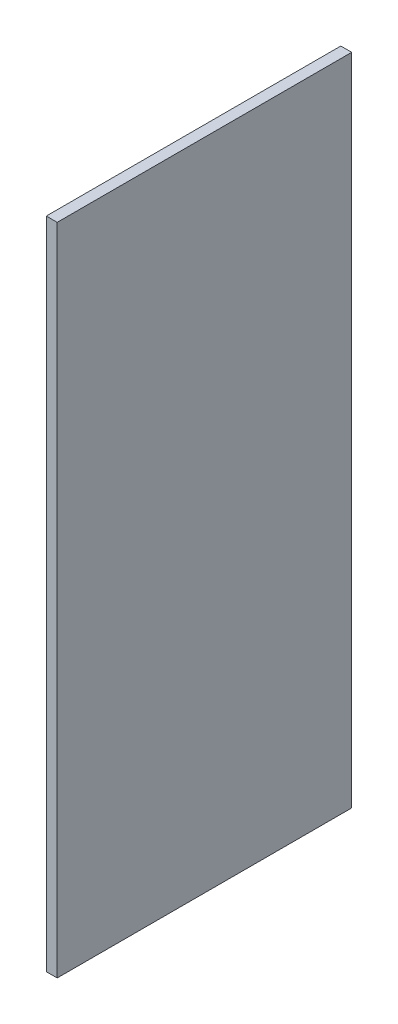
ISO-10303-21;
HEADER;
FILE_DESCRIPTION(('STEP AP214'),'2;1');
FILE_NAME('part.step','',(''),(''),'','','');
FILE_SCHEMA(('AUTOMOTIVE_DESIGN { 1 0 10303 214 1 1 1 1 }'));
ENDSEC;
DATA;
#1=APPLICATION_CONTEXT('core data for automotive mechanical design processes');
#2=APPLICATION_PROTOCOL_DEFINITION('international standard','automotive_design',2000,#1);
#3=PRODUCT_CONTEXT('',#1,'mechanical');
#4=PRODUCT('Part','Part','',(#3));
#5=PRODUCT_RELATED_PRODUCT_CATEGORY('part','',(#4));
#6=PRODUCT_DEFINITION_FORMATION('','',#4);
#7=PRODUCT_DEFINITION_CONTEXT('part definition',#1,'design');
#8=PRODUCT_DEFINITION('design','',#6,#7);
#9=PRODUCT_DEFINITION_SHAPE('','',#8);
#10=(LENGTH_UNIT() NAMED_UNIT(*) SI_UNIT(.MILLI.,.METRE.));
#11=(NAMED_UNIT(*) PLANE_ANGLE_UNIT() SI_UNIT($,.RADIAN.));
#12=(NAMED_UNIT(*) SI_UNIT($,.STERADIAN.) SOLID_ANGLE_UNIT());
#13=UNCERTAINTY_MEASURE_WITH_UNIT(LENGTH_MEASURE(1.E-05),#10,'distance_accuracy_value','');
#14=(GEOMETRIC_REPRESENTATION_CONTEXT(3) GLOBAL_UNCERTAINTY_ASSIGNED_CONTEXT((#13)) GLOBAL_UNIT_ASSIGNED_CONTEXT((#10,
#11,#12)) REPRESENTATION_CONTEXT('',''));
#15=CARTESIAN_POINT('',(0.,0.,0.));
#16=DIRECTION('',(0.,0.,1.));
#17=DIRECTION('',(1.,0.,0.));
#18=AXIS2_PLACEMENT_3D('',#15,#16,#17);
#19=CARTESIAN_POINT('',(5.,-150.,-67.5));
#20=DIRECTION('',(0.,0.,1.));
#21=DIRECTION('',(1.,0.,0.));
#22=AXIS2_PLACEMENT_3D('',#19,#20,#21);
#23=PLANE('',#22);
#24=DIRECTION('',(0.,1.,0.));
#25=VECTOR('',#24,1.);
#26=CARTESIAN_POINT('',(0.,-150.,-67.5));
#27=LINE('',#26,#25);
#28=CARTESIAN_POINT('',(0.,-150.,-67.5));
#29=VERTEX_POINT('',#28);
#30=CARTESIAN_POINT('',(0.,150.,-67.5));
#31=VERTEX_POINT('',#30);
#32=EDGE_CURVE('E99',#29,#31,#27,.T.);
#33=ORIENTED_EDGE('',*,*,#32,.T.);
#34=DIRECTION('',(-1.,0.,0.));
#35=VECTOR('',#34,1.);
#36=CARTESIAN_POINT('',(5.,150.,-67.5));
#37=LINE('',#36,#35);
#38=CARTESIAN_POINT('',(5.,150.,-67.5));
#39=VERTEX_POINT('',#38);
#40=EDGE_CURVE('E12',#39,#31,#37,.T.);
#41=ORIENTED_EDGE('',*,*,#40,.F.);
#42=DIRECTION('',(0.,1.,0.));
#43=VECTOR('',#42,1.);
#44=CARTESIAN_POINT('',(5.,-150.,-67.5));
#45=LINE('',#44,#43);
#46=CARTESIAN_POINT('',(5.,-150.,-67.5));
#47=VERTEX_POINT('',#46);
#48=EDGE_CURVE('E87',#47,#39,#45,.T.);
#49=ORIENTED_EDGE('',*,*,#48,.F.);
#50=DIRECTION('',(-1.,0.,0.));
#51=VECTOR('',#50,1.);
#52=CARTESIAN_POINT('',(5.,-150.,-67.5));
#53=LINE('',#52,#51);
#54=EDGE_CURVE('E95',#47,#29,#53,.T.);
#55=ORIENTED_EDGE('',*,*,#54,.T.);
#56=EDGE_LOOP('',(#33,#41,#49,#55));
#57=FACE_BOUND('',#56,.T.);
#58=ADVANCED_FACE('F36',(#57),#23,.F.);
#59=CARTESIAN_POINT('',(5.,150.,67.5));
#60=DIRECTION('',(0.,-1.,0.));
#61=DIRECTION('',(0.,0.,-1.));
#62=AXIS2_PLACEMENT_3D('',#59,#60,#61);
#63=PLANE('',#62);
#64=DIRECTION('',(0.,0.,1.));
#65=VECTOR('',#64,1.);
#66=CARTESIAN_POINT('',(0.,150.,67.5));
#67=LINE('',#66,#65);
#68=CARTESIAN_POINT('',(0.,150.,67.5));
#69=VERTEX_POINT('',#68);
#70=EDGE_CURVE('E91',#31,#69,#67,.T.);
#71=ORIENTED_EDGE('',*,*,#70,.T.);
#72=DIRECTION('',(-1.,0.,0.));
#73=VECTOR('',#72,1.);
#74=CARTESIAN_POINT('',(5.,150.,67.5));
#75=LINE('',#74,#73);
#76=CARTESIAN_POINT('',(5.,150.,67.5));
#77=VERTEX_POINT('',#76);
#78=EDGE_CURVE('E44',#77,#69,#75,.T.);
#79=ORIENTED_EDGE('',*,*,#78,.F.);
#80=DIRECTION('',(0.,0.,1.));
#81=VECTOR('',#80,1.);
#82=CARTESIAN_POINT('',(5.,150.,67.5));
#83=LINE('',#82,#81);
#84=EDGE_CURVE('E82',#39,#77,#83,.T.);
#85=ORIENTED_EDGE('',*,*,#84,.F.);
#86=ORIENTED_EDGE('',*,*,#40,.T.);
#87=EDGE_LOOP('',(#71,#79,#85,#86));
#88=FACE_BOUND('',#87,.T.);
#89=ADVANCED_FACE('F90',(#88),#63,.F.);
#90=CARTESIAN_POINT('',(5.,-150.,67.5));
#91=DIRECTION('',(0.,0.,-1.));
#92=DIRECTION('',(-1.,0.,0.));
#93=AXIS2_PLACEMENT_3D('',#90,#91,#92);
#94=PLANE('',#93);
#95=DIRECTION('',(0.,-1.,0.));
#96=VECTOR('',#95,1.);
#97=CARTESIAN_POINT('',(0.,-150.,67.5));
#98=LINE('',#97,#96);
#99=CARTESIAN_POINT('',(0.,-150.,67.5));
#100=VERTEX_POINT('',#99);
#101=EDGE_CURVE('E69',#69,#100,#98,.T.);
#102=ORIENTED_EDGE('',*,*,#101,.T.);
#103=DIRECTION('',(-1.,0.,0.));
#104=VECTOR('',#103,1.);
#105=CARTESIAN_POINT('',(5.,-150.,67.5));
#106=LINE('',#105,#104);
#107=CARTESIAN_POINT('',(5.,-150.,67.5));
#108=VERTEX_POINT('',#107);
#109=EDGE_CURVE('E92',#108,#100,#106,.T.);
#110=ORIENTED_EDGE('',*,*,#109,.F.);
#111=DIRECTION('',(0.,-1.,0.));
#112=VECTOR('',#111,1.);
#113=CARTESIAN_POINT('',(5.,-150.,67.5));
#114=LINE('',#113,#112);
#115=EDGE_CURVE('E85',#77,#108,#114,.T.);
#116=ORIENTED_EDGE('',*,*,#115,.F.);
#117=ORIENTED_EDGE('',*,*,#78,.T.);
#118=EDGE_LOOP('',(#102,#110,#116,#117));
#119=FACE_BOUND('',#118,.T.);
#120=ADVANCED_FACE('F93',(#119),#94,.F.);
#121=CARTESIAN_POINT('',(5.,-150.,67.5));
#122=DIRECTION('',(0.,1.,0.));
#123=DIRECTION('',(0.,0.,1.));
#124=AXIS2_PLACEMENT_3D('',#121,#122,#123);
#125=PLANE('',#124);
#126=DIRECTION('',(0.,0.,-1.));
#127=VECTOR('',#126,1.);
#128=CARTESIAN_POINT('',(0.,-150.,67.5));
#129=LINE('',#128,#127);
#130=EDGE_CURVE('E75',#100,#29,#129,.T.);
#131=ORIENTED_EDGE('',*,*,#130,.T.);
#132=ORIENTED_EDGE('',*,*,#54,.F.);
#133=DIRECTION('',(0.,0.,-1.));
#134=VECTOR('',#133,1.);
#135=CARTESIAN_POINT('',(5.,-150.,67.5));
#136=LINE('',#135,#134);
#137=EDGE_CURVE('E52',#108,#47,#136,.T.);
#138=ORIENTED_EDGE('',*,*,#137,.F.);
#139=ORIENTED_EDGE('',*,*,#109,.T.);
#140=EDGE_LOOP('',(#131,#132,#138,#139));
#141=FACE_BOUND('',#140,.T.);
#142=ADVANCED_FACE('F113',(#141),#125,.F.);
#143=CARTESIAN_POINT('',(5.,0.,0.));
#144=DIRECTION('',(-1.,0.,0.));
#145=DIRECTION('',(0.,0.,1.));
#146=AXIS2_PLACEMENT_3D('',#143,#144,#145);
#147=PLANE('',#146);
#148=ORIENTED_EDGE('',*,*,#48,.T.);
#149=ORIENTED_EDGE('',*,*,#84,.T.);
#150=ORIENTED_EDGE('',*,*,#115,.T.);
#151=ORIENTED_EDGE('',*,*,#137,.T.);
#152=EDGE_LOOP('',(#148,#149,#150,#151));
#153=FACE_BOUND('',#152,.T.);
#154=ADVANCED_FACE('F83',(#153),#147,.F.);
#155=CARTESIAN_POINT('',(0.,0.,0.));
#156=DIRECTION('',(-1.,0.,0.));
#157=DIRECTION('',(0.,0.,1.));
#158=AXIS2_PLACEMENT_3D('',#155,#156,#157);
#159=PLANE('',#158);
#160=ORIENTED_EDGE('',*,*,#32,.F.);
#161=ORIENTED_EDGE('',*,*,#130,.F.);
#162=ORIENTED_EDGE('',*,*,#101,.F.);
#163=ORIENTED_EDGE('',*,*,#70,.F.);
#164=EDGE_LOOP('',(#160,#161,#162,#163));
#165=FACE_BOUND('',#164,.T.);
#166=ADVANCED_FACE('F116',(#165),#159,.T.);
#167=CLOSED_SHELL('',(#58,#89,#120,#142,#154,#166));
#168=MANIFOLD_SOLID_BREP('B2',#167);
#169=ADVANCED_BREP_SHAPE_REPRESENTATION('',(#18,#168),#14);
#170=SHAPE_DEFINITION_REPRESENTATION(#9,#169);
ENDSEC;
END-ISO-10303-21;
